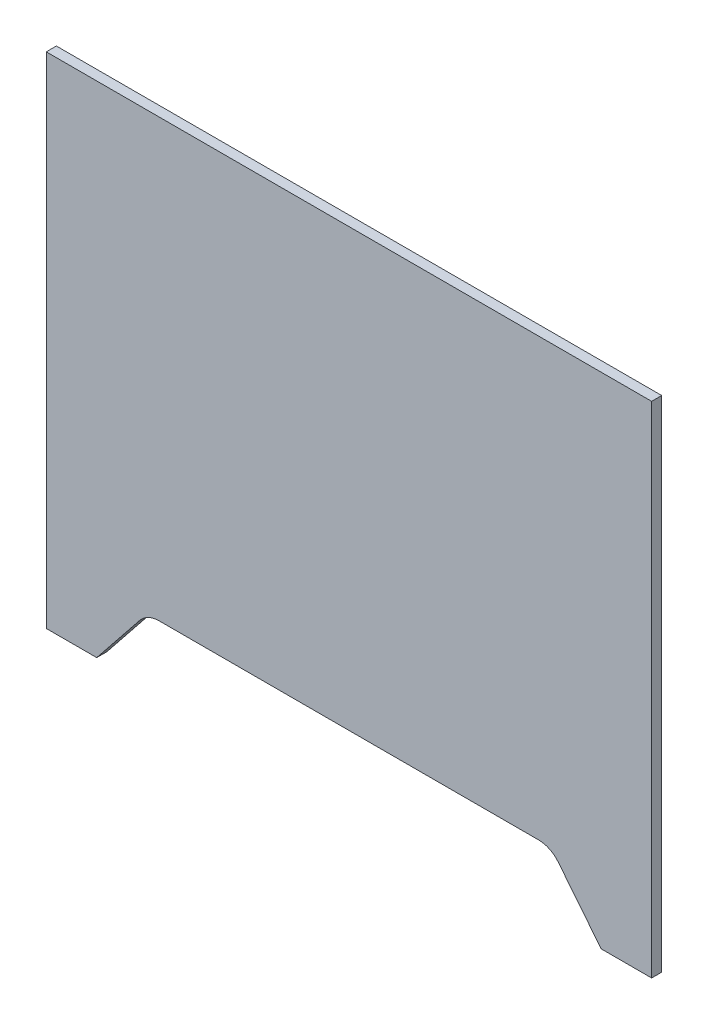
ISO-10303-21;
HEADER;
FILE_DESCRIPTION(('STEP AP214'),'2;1');
FILE_NAME('part.step','',(''),(''),'','','');
FILE_SCHEMA(('AUTOMOTIVE_DESIGN { 1 0 10303 214 1 1 1 1 }'));
ENDSEC;
DATA;
#1=APPLICATION_CONTEXT('core data for automotive mechanical design processes');
#2=APPLICATION_PROTOCOL_DEFINITION('international standard','automotive_design',2000,#1);
#3=PRODUCT_CONTEXT('',#1,'mechanical');
#4=PRODUCT('Part','Part','',(#3));
#5=PRODUCT_RELATED_PRODUCT_CATEGORY('part','',(#4));
#6=PRODUCT_DEFINITION_FORMATION('','',#4);
#7=PRODUCT_DEFINITION_CONTEXT('part definition',#1,'design');
#8=PRODUCT_DEFINITION('design','',#6,#7);
#9=PRODUCT_DEFINITION_SHAPE('','',#8);
#10=(LENGTH_UNIT() NAMED_UNIT(*) SI_UNIT(.MILLI.,.METRE.));
#11=(NAMED_UNIT(*) PLANE_ANGLE_UNIT() SI_UNIT($,.RADIAN.));
#12=(NAMED_UNIT(*) SI_UNIT($,.STERADIAN.) SOLID_ANGLE_UNIT());
#13=UNCERTAINTY_MEASURE_WITH_UNIT(LENGTH_MEASURE(1.E-05),#10,'distance_accuracy_value','');
#14=(GEOMETRIC_REPRESENTATION_CONTEXT(3) GLOBAL_UNCERTAINTY_ASSIGNED_CONTEXT((#13)) GLOBAL_UNIT_ASSIGNED_CONTEXT((#10,
#11,#12)) REPRESENTATION_CONTEXT('',''));
#15=CARTESIAN_POINT('',(0.,0.,0.));
#16=DIRECTION('',(0.,0.,1.));
#17=DIRECTION('',(1.,0.,0.));
#18=AXIS2_PLACEMENT_3D('',#15,#16,#17);
#19=CARTESIAN_POINT('',(120.,-99.,4.));
#20=DIRECTION('',(-1.,0.,0.));
#21=DIRECTION('',(0.,0.,1.));
#22=AXIS2_PLACEMENT_3D('',#19,#20,#21);
#23=PLANE('',#22);
#24=DIRECTION('',(0.,1.,0.));
#25=VECTOR('',#24,1.);
#26=CARTESIAN_POINT('',(120.,-99.,0.));
#27=LINE('',#26,#25);
#28=CARTESIAN_POINT('',(120.,-99.,0.));
#29=VERTEX_POINT('',#28);
#30=CARTESIAN_POINT('',(120.,99.,0.));
#31=VERTEX_POINT('',#30);
#32=EDGE_CURVE('E147',#29,#31,#27,.T.);
#33=ORIENTED_EDGE('',*,*,#32,.T.);
#34=DIRECTION('',(0.,0.,-1.));
#35=VECTOR('',#34,1.);
#36=CARTESIAN_POINT('',(120.,99.,4.));
#37=LINE('',#36,#35);
#38=CARTESIAN_POINT('',(120.,99.,4.));
#39=VERTEX_POINT('',#38);
#40=EDGE_CURVE('E11',#39,#31,#37,.T.);
#41=ORIENTED_EDGE('',*,*,#40,.F.);
#42=DIRECTION('',(0.,1.,0.));
#43=VECTOR('',#42,1.);
#44=CARTESIAN_POINT('',(120.,-99.,4.));
#45=LINE('',#44,#43);
#46=CARTESIAN_POINT('',(120.,-99.,4.));
#47=VERTEX_POINT('',#46);
#48=EDGE_CURVE('E165',#47,#39,#45,.T.);
#49=ORIENTED_EDGE('',*,*,#48,.F.);
#50=DIRECTION('',(0.,0.,-1.));
#51=VECTOR('',#50,1.);
#52=CARTESIAN_POINT('',(120.,-99.,4.));
#53=LINE('',#52,#51);
#54=EDGE_CURVE('E143',#47,#29,#53,.T.);
#55=ORIENTED_EDGE('',*,*,#54,.T.);
#56=EDGE_LOOP('',(#33,#41,#49,#55));
#57=FACE_BOUND('',#56,.T.);
#58=ADVANCED_FACE('F39',(#57),#23,.F.);
#59=CARTESIAN_POINT('',(-120.,99.,4.));
#60=DIRECTION('',(0.,-1.,0.));
#61=DIRECTION('',(0.,0.,-1.));
#62=AXIS2_PLACEMENT_3D('',#59,#60,#61);
#63=PLANE('',#62);
#64=DIRECTION('',(-1.,0.,0.));
#65=VECTOR('',#64,1.);
#66=CARTESIAN_POINT('',(-120.,99.,0.));
#67=LINE('',#66,#65);
#68=CARTESIAN_POINT('',(-120.,99.,0.));
#69=VERTEX_POINT('',#68);
#70=EDGE_CURVE('E150',#31,#69,#67,.T.);
#71=ORIENTED_EDGE('',*,*,#70,.T.);
#72=DIRECTION('',(0.,0.,-1.));
#73=VECTOR('',#72,1.);
#74=CARTESIAN_POINT('',(-120.,99.,4.));
#75=LINE('',#74,#73);
#76=CARTESIAN_POINT('',(-120.,99.,4.));
#77=VERTEX_POINT('',#76);
#78=EDGE_CURVE('E47',#77,#69,#75,.T.);
#79=ORIENTED_EDGE('',*,*,#78,.F.);
#80=DIRECTION('',(-1.,0.,0.));
#81=VECTOR('',#80,1.);
#82=CARTESIAN_POINT('',(-120.,99.,4.));
#83=LINE('',#82,#81);
#84=EDGE_CURVE('E104',#39,#77,#83,.T.);
#85=ORIENTED_EDGE('',*,*,#84,.F.);
#86=ORIENTED_EDGE('',*,*,#40,.T.);
#87=EDGE_LOOP('',(#71,#79,#85,#86));
#88=FACE_BOUND('',#87,.T.);
#89=ADVANCED_FACE('F214',(#88),#63,.F.);
#90=CARTESIAN_POINT('',(-120.,-99.,4.));
#91=DIRECTION('',(1.,0.,0.));
#92=DIRECTION('',(0.,0.,-1.));
#93=AXIS2_PLACEMENT_3D('',#90,#91,#92);
#94=PLANE('',#93);
#95=DIRECTION('',(0.,-1.,0.));
#96=VECTOR('',#95,1.);
#97=CARTESIAN_POINT('',(-120.,-99.,0.));
#98=LINE('',#97,#96);
#99=CARTESIAN_POINT('',(-120.,-99.,0.));
#100=VERTEX_POINT('',#99);
#101=EDGE_CURVE('E152',#69,#100,#98,.T.);
#102=ORIENTED_EDGE('',*,*,#101,.T.);
#103=DIRECTION('',(0.,0.,-1.));
#104=VECTOR('',#103,1.);
#105=CARTESIAN_POINT('',(-120.,-99.,4.));
#106=LINE('',#105,#104);
#107=CARTESIAN_POINT('',(-120.,-99.,4.));
#108=VERTEX_POINT('',#107);
#109=EDGE_CURVE('E178',#108,#100,#106,.T.);
#110=ORIENTED_EDGE('',*,*,#109,.F.);
#111=DIRECTION('',(0.,-1.,0.));
#112=VECTOR('',#111,1.);
#113=CARTESIAN_POINT('',(-120.,-99.,4.));
#114=LINE('',#113,#112);
#115=EDGE_CURVE('E186',#77,#108,#114,.T.);
#116=ORIENTED_EDGE('',*,*,#115,.F.);
#117=ORIENTED_EDGE('',*,*,#78,.T.);
#118=EDGE_LOOP('',(#102,#110,#116,#117));
#119=FACE_BOUND('',#118,.T.);
#120=ADVANCED_FACE('F184',(#119),#94,.F.);
#121=CARTESIAN_POINT('',(-100.,-99.,4.));
#122=DIRECTION('',(0.,1.,0.));
#123=DIRECTION('',(0.,0.,1.));
#124=AXIS2_PLACEMENT_3D('',#121,#122,#123);
#125=PLANE('',#124);
#126=DIRECTION('',(1.,0.,0.));
#127=VECTOR('',#126,1.);
#128=CARTESIAN_POINT('',(-100.,-99.,0.));
#129=LINE('',#128,#127);
#130=CARTESIAN_POINT('',(-100.,-99.,0.));
#131=VERTEX_POINT('',#130);
#132=EDGE_CURVE('E154',#100,#131,#129,.T.);
#133=ORIENTED_EDGE('',*,*,#132,.T.);
#134=DIRECTION('',(0.,0.,-1.));
#135=VECTOR('',#134,1.);
#136=CARTESIAN_POINT('',(-100.,-99.,4.));
#137=LINE('',#136,#135);
#138=CARTESIAN_POINT('',(-100.,-99.,4.));
#139=VERTEX_POINT('',#138);
#140=EDGE_CURVE('E175',#139,#131,#137,.T.);
#141=ORIENTED_EDGE('',*,*,#140,.F.);
#142=DIRECTION('',(1.,0.,0.));
#143=VECTOR('',#142,1.);
#144=CARTESIAN_POINT('',(-100.,-99.,4.));
#145=LINE('',#144,#143);
#146=EDGE_CURVE('E204',#108,#139,#145,.T.);
#147=ORIENTED_EDGE('',*,*,#146,.F.);
#148=ORIENTED_EDGE('',*,*,#109,.T.);
#149=EDGE_LOOP('',(#133,#141,#147,#148));
#150=FACE_BOUND('',#149,.T.);
#151=ADVANCED_FACE('F195',(#150),#125,.F.);
#152=CARTESIAN_POINT('',(-83.0024396195646,-77.7530495244557,4.));
#153=DIRECTION('',(-0.78086880944303,0.624695047554424,0.));
#154=DIRECTION('',(-0.624695047554424,-0.78086880944303,0.));
#155=AXIS2_PLACEMENT_3D('',#152,#153,#154);
#156=PLANE('',#155);
#157=DIRECTION('',(0.624695047554424,0.78086880944303,0.));
#158=VECTOR('',#157,1.);
#159=CARTESIAN_POINT('',(-83.0024396195646,-77.7530495244557,0.));
#160=LINE('',#159,#158);
#161=CARTESIAN_POINT('',(-83.0024396195646,-77.7530495244557,0.));
#162=VERTEX_POINT('',#161);
#163=EDGE_CURVE('E156',#131,#162,#160,.T.);
#164=ORIENTED_EDGE('',*,*,#163,.T.);
#165=DIRECTION('',(0.,0.,-1.));
#166=VECTOR('',#165,1.);
#167=CARTESIAN_POINT('',(-83.0024396195646,-77.7530495244557,4.));
#168=LINE('',#167,#166);
#169=CARTESIAN_POINT('',(-83.0024396195646,-77.7530495244557,4.));
#170=VERTEX_POINT('',#169);
#171=EDGE_CURVE('E172',#170,#162,#168,.T.);
#172=ORIENTED_EDGE('',*,*,#171,.F.);
#173=DIRECTION('',(0.624695047554424,0.78086880944303,0.));
#174=VECTOR('',#173,1.);
#175=CARTESIAN_POINT('',(-83.0024396195646,-77.7530495244557,4.));
#176=LINE('',#175,#174);
#177=EDGE_CURVE('E201',#139,#170,#176,.T.);
#178=ORIENTED_EDGE('',*,*,#177,.F.);
#179=ORIENTED_EDGE('',*,*,#140,.T.);
#180=EDGE_LOOP('',(#164,#172,#178,#179));
#181=FACE_BOUND('',#180,.T.);
#182=ADVANCED_FACE('F199',(#181),#156,.F.);
#183=CARTESIAN_POINT('',(-75.1937515251343,-84.,4.));
#184=DIRECTION('',(0.,0.,-1.));
#185=DIRECTION('',(-1.,0.,0.));
#186=AXIS2_PLACEMENT_3D('',#183,#184,#185);
#187=CYLINDRICAL_SURFACE('',#186,10.);
#188=CARTESIAN_POINT('',(-75.1937515251343,-84.,0.));
#189=DIRECTION('',(0.,0.,-1.));
#190=DIRECTION('',(-1.,0.,0.));
#191=AXIS2_PLACEMENT_3D('',#188,#189,#190);
#192=CIRCLE('',#191,10.);
#193=CARTESIAN_POINT('',(-75.1937515251343,-74.,0.));
#194=VERTEX_POINT('',#193);
#195=EDGE_CURVE('E158',#162,#194,#192,.T.);
#196=ORIENTED_EDGE('',*,*,#195,.T.);
#197=DIRECTION('',(0.,0.,-1.));
#198=VECTOR('',#197,1.);
#199=CARTESIAN_POINT('',(-75.1937515251343,-74.,4.));
#200=LINE('',#199,#198);
#201=CARTESIAN_POINT('',(-75.1937515251343,-74.,4.));
#202=VERTEX_POINT('',#201);
#203=EDGE_CURVE('E169',#202,#194,#200,.T.);
#204=ORIENTED_EDGE('',*,*,#203,.F.);
#205=CARTESIAN_POINT('',(-75.1937515251343,-84.,4.));
#206=DIRECTION('',(0.,0.,-1.));
#207=DIRECTION('',(-1.,0.,0.));
#208=AXIS2_PLACEMENT_3D('',#205,#206,#207);
#209=CIRCLE('',#208,10.);
#210=EDGE_CURVE('E203',#170,#202,#209,.T.);
#211=ORIENTED_EDGE('',*,*,#210,.F.);
#212=ORIENTED_EDGE('',*,*,#171,.T.);
#213=EDGE_LOOP('',(#196,#204,#211,#212));
#214=FACE_BOUND('',#213,.T.);
#215=ADVANCED_FACE('F226',(#214),#187,.F.);
#216=CARTESIAN_POINT('',(-75.1937515251343,-74.,4.));
#217=DIRECTION('',(0.,1.,0.));
#218=DIRECTION('',(0.,0.,1.));
#219=AXIS2_PLACEMENT_3D('',#216,#217,#218);
#220=PLANE('',#219);
#221=DIRECTION('',(1.,0.,0.));
#222=VECTOR('',#221,1.);
#223=CARTESIAN_POINT('',(-75.1937515251343,-74.,0.));
#224=LINE('',#223,#222);
#225=CARTESIAN_POINT('',(75.1937515251343,-74.,0.));
#226=VERTEX_POINT('',#225);
#227=EDGE_CURVE('E160',#194,#226,#224,.T.);
#228=ORIENTED_EDGE('',*,*,#227,.T.);
#229=DIRECTION('',(0.,0.,-1.));
#230=VECTOR('',#229,1.);
#231=CARTESIAN_POINT('',(75.1937515251343,-74.,4.));
#232=LINE('',#231,#230);
#233=CARTESIAN_POINT('',(75.1937515251343,-74.,4.));
#234=VERTEX_POINT('',#233);
#235=EDGE_CURVE('E138',#234,#226,#232,.T.);
#236=ORIENTED_EDGE('',*,*,#235,.F.);
#237=DIRECTION('',(1.,0.,0.));
#238=VECTOR('',#237,1.);
#239=CARTESIAN_POINT('',(-75.1937515251343,-74.,4.));
#240=LINE('',#239,#238);
#241=EDGE_CURVE('E129',#202,#234,#240,.T.);
#242=ORIENTED_EDGE('',*,*,#241,.F.);
#243=ORIENTED_EDGE('',*,*,#203,.T.);
#244=EDGE_LOOP('',(#228,#236,#242,#243));
#245=FACE_BOUND('',#244,.T.);
#246=ADVANCED_FACE('F229',(#245),#220,.F.);
#247=CARTESIAN_POINT('',(75.1937515251343,-84.,4.));
#248=DIRECTION('',(0.,0.,-1.));
#249=DIRECTION('',(-1.,0.,0.));
#250=AXIS2_PLACEMENT_3D('',#247,#248,#249);
#251=CYLINDRICAL_SURFACE('',#250,10.);
#252=CARTESIAN_POINT('',(75.1937515251343,-84.,0.));
#253=DIRECTION('',(0.,0.,-1.));
#254=DIRECTION('',(1.,0.,0.));
#255=AXIS2_PLACEMENT_3D('',#252,#253,#254);
#256=CIRCLE('',#255,10.);
#257=CARTESIAN_POINT('',(83.0024396195646,-77.7530495244557,0.));
#258=VERTEX_POINT('',#257);
#259=EDGE_CURVE('E137',#226,#258,#256,.T.);
#260=ORIENTED_EDGE('',*,*,#259,.T.);
#261=DIRECTION('',(0.,0.,-1.));
#262=VECTOR('',#261,1.);
#263=CARTESIAN_POINT('',(83.0024396195646,-77.7530495244557,4.));
#264=LINE('',#263,#262);
#265=CARTESIAN_POINT('',(83.0024396195646,-77.7530495244557,4.));
#266=VERTEX_POINT('',#265);
#267=EDGE_CURVE('E134',#266,#258,#264,.T.);
#268=ORIENTED_EDGE('',*,*,#267,.F.);
#269=CARTESIAN_POINT('',(75.1937515251343,-84.,4.));
#270=DIRECTION('',(0.,0.,-1.));
#271=DIRECTION('',(1.,0.,0.));
#272=AXIS2_PLACEMENT_3D('',#269,#270,#271);
#273=CIRCLE('',#272,10.);
#274=EDGE_CURVE('E123',#234,#266,#273,.T.);
#275=ORIENTED_EDGE('',*,*,#274,.F.);
#276=ORIENTED_EDGE('',*,*,#235,.T.);
#277=EDGE_LOOP('',(#260,#268,#275,#276));
#278=FACE_BOUND('',#277,.T.);
#279=ADVANCED_FACE('F135',(#278),#251,.F.);
#280=CARTESIAN_POINT('',(83.0024396195646,-77.7530495244557,4.));
#281=DIRECTION('',(0.78086880944303,0.624695047554424,0.));
#282=DIRECTION('',(-0.624695047554424,0.78086880944303,0.));
#283=AXIS2_PLACEMENT_3D('',#280,#281,#282);
#284=PLANE('',#283);
#285=DIRECTION('',(0.624695047554424,-0.78086880944303,0.));
#286=VECTOR('',#285,1.);
#287=CARTESIAN_POINT('',(83.0024396195646,-77.7530495244557,0.));
#288=LINE('',#287,#286);
#289=CARTESIAN_POINT('',(100.,-99.,0.));
#290=VERTEX_POINT('',#289);
#291=EDGE_CURVE('E90',#258,#290,#288,.T.);
#292=ORIENTED_EDGE('',*,*,#291,.T.);
#293=DIRECTION('',(0.,0.,-1.));
#294=VECTOR('',#293,1.);
#295=CARTESIAN_POINT('',(100.,-99.,4.));
#296=LINE('',#295,#294);
#297=CARTESIAN_POINT('',(100.,-99.,4.));
#298=VERTEX_POINT('',#297);
#299=EDGE_CURVE('E139',#298,#290,#296,.T.);
#300=ORIENTED_EDGE('',*,*,#299,.F.);
#301=DIRECTION('',(0.624695047554424,-0.78086880944303,0.));
#302=VECTOR('',#301,1.);
#303=CARTESIAN_POINT('',(83.0024396195646,-77.7530495244557,4.));
#304=LINE('',#303,#302);
#305=EDGE_CURVE('E127',#266,#298,#304,.T.);
#306=ORIENTED_EDGE('',*,*,#305,.F.);
#307=ORIENTED_EDGE('',*,*,#267,.T.);
#308=EDGE_LOOP('',(#292,#300,#306,#307));
#309=FACE_BOUND('',#308,.T.);
#310=ADVANCED_FACE('F141',(#309),#284,.F.);
#311=CARTESIAN_POINT('',(100.,-99.,4.));
#312=DIRECTION('',(0.,1.,0.));
#313=DIRECTION('',(0.,0.,1.));
#314=AXIS2_PLACEMENT_3D('',#311,#312,#313);
#315=PLANE('',#314);
#316=DIRECTION('',(1.,0.,0.));
#317=VECTOR('',#316,1.);
#318=CARTESIAN_POINT('',(100.,-99.,0.));
#319=LINE('',#318,#317);
#320=EDGE_CURVE('E96',#290,#29,#319,.T.);
#321=ORIENTED_EDGE('',*,*,#320,.T.);
#322=ORIENTED_EDGE('',*,*,#54,.F.);
#323=DIRECTION('',(1.,0.,0.));
#324=VECTOR('',#323,1.);
#325=CARTESIAN_POINT('',(100.,-99.,4.));
#326=LINE('',#325,#324);
#327=EDGE_CURVE('E55',#298,#47,#326,.T.);
#328=ORIENTED_EDGE('',*,*,#327,.F.);
#329=ORIENTED_EDGE('',*,*,#299,.T.);
#330=EDGE_LOOP('',(#321,#322,#328,#329));
#331=FACE_BOUND('',#330,.T.);
#332=ADVANCED_FACE('F238',(#331),#315,.F.);
#333=CARTESIAN_POINT('',(-75.1937515251343,-84.,4.));
#334=DIRECTION('',(0.,0.,-1.));
#335=DIRECTION('',(-1.,0.,0.));
#336=AXIS2_PLACEMENT_3D('',#333,#334,#335);
#337=PLANE('',#336);
#338=ORIENTED_EDGE('',*,*,#48,.T.);
#339=ORIENTED_EDGE('',*,*,#84,.T.);
#340=ORIENTED_EDGE('',*,*,#115,.T.);
#341=ORIENTED_EDGE('',*,*,#146,.T.);
#342=ORIENTED_EDGE('',*,*,#177,.T.);
#343=ORIENTED_EDGE('',*,*,#210,.T.);
#344=ORIENTED_EDGE('',*,*,#241,.T.);
#345=ORIENTED_EDGE('',*,*,#274,.T.);
#346=ORIENTED_EDGE('',*,*,#305,.T.);
#347=ORIENTED_EDGE('',*,*,#327,.T.);
#348=EDGE_LOOP('',(#338,#339,#340,#341,#342,#343,#344,#345,#346,#347));
#349=FACE_BOUND('',#348,.T.);
#350=ADVANCED_FACE('F125',(#349),#337,.F.);
#351=CARTESIAN_POINT('',(-75.1937515251343,-84.,0.));
#352=DIRECTION('',(0.,0.,-1.));
#353=DIRECTION('',(-1.,0.,0.));
#354=AXIS2_PLACEMENT_3D('',#351,#352,#353);
#355=PLANE('',#354);
#356=ORIENTED_EDGE('',*,*,#32,.F.);
#357=ORIENTED_EDGE('',*,*,#320,.F.);
#358=ORIENTED_EDGE('',*,*,#291,.F.);
#359=ORIENTED_EDGE('',*,*,#259,.F.);
#360=ORIENTED_EDGE('',*,*,#227,.F.);
#361=ORIENTED_EDGE('',*,*,#195,.F.);
#362=ORIENTED_EDGE('',*,*,#163,.F.);
#363=ORIENTED_EDGE('',*,*,#132,.F.);
#364=ORIENTED_EDGE('',*,*,#101,.F.);
#365=ORIENTED_EDGE('',*,*,#70,.F.);
#366=EDGE_LOOP('',(#356,#357,#358,#359,#360,#361,#362,#363,#364,#365));
#367=FACE_BOUND('',#366,.T.);
#368=ADVANCED_FACE('F190',(#367),#355,.T.);
#369=CLOSED_SHELL('',(#58,#89,#120,#151,#182,#215,#246,#279,#310,#332,#350,#368));
#370=MANIFOLD_SOLID_BREP('B2',#369);
#371=ADVANCED_BREP_SHAPE_REPRESENTATION('',(#18,#370),#14);
#372=SHAPE_DEFINITION_REPRESENTATION(#9,#371);
ENDSEC;
END-ISO-10303-21;
